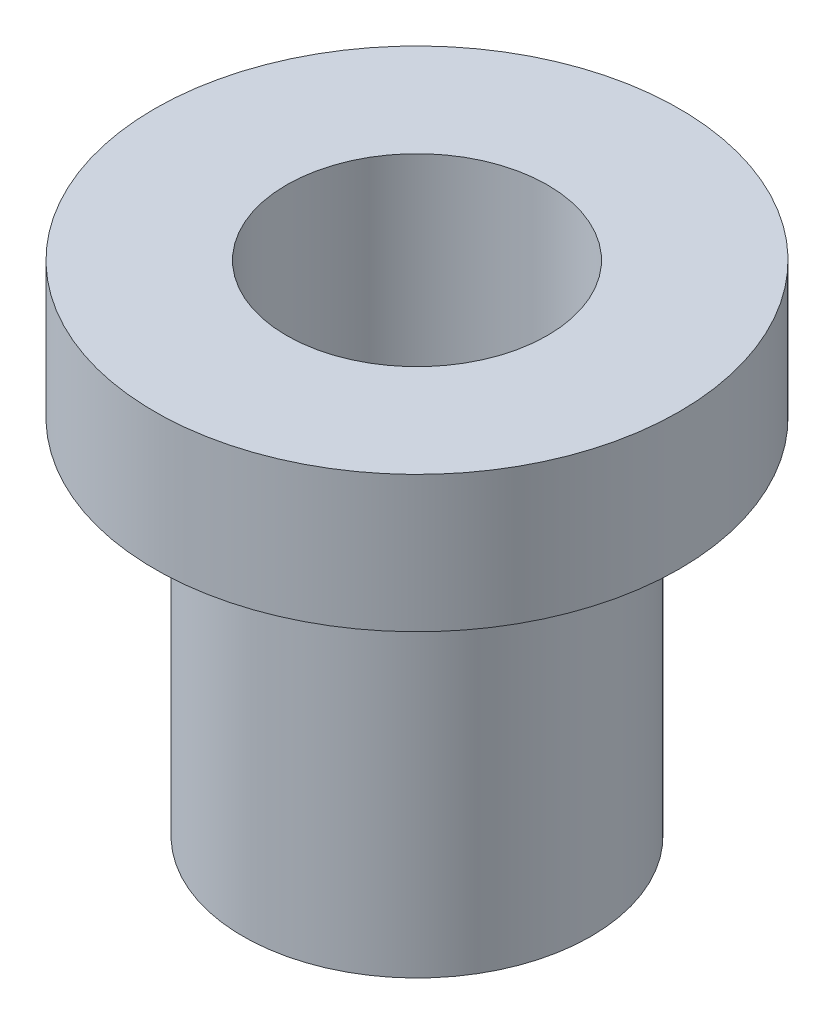
ISO-10303-21;
HEADER;
FILE_DESCRIPTION(('STEP AP214'),'2;1');
FILE_NAME('part.step','',(''),(''),'','','');
FILE_SCHEMA(('AUTOMOTIVE_DESIGN { 1 0 10303 214 1 1 1 1 }'));
ENDSEC;
DATA;
#1=APPLICATION_CONTEXT('core data for automotive mechanical design processes');
#2=APPLICATION_PROTOCOL_DEFINITION('international standard','automotive_design',2000,#1);
#3=PRODUCT_CONTEXT('',#1,'mechanical');
#4=PRODUCT('Part','Part','',(#3));
#5=PRODUCT_RELATED_PRODUCT_CATEGORY('part','',(#4));
#6=PRODUCT_DEFINITION_FORMATION('','',#4);
#7=PRODUCT_DEFINITION_CONTEXT('part definition',#1,'design');
#8=PRODUCT_DEFINITION('design','',#6,#7);
#9=PRODUCT_DEFINITION_SHAPE('','',#8);
#10=(LENGTH_UNIT() NAMED_UNIT(*) SI_UNIT(.MILLI.,.METRE.));
#11=(NAMED_UNIT(*) PLANE_ANGLE_UNIT() SI_UNIT($,.RADIAN.));
#12=(NAMED_UNIT(*) SI_UNIT($,.STERADIAN.) SOLID_ANGLE_UNIT());
#13=UNCERTAINTY_MEASURE_WITH_UNIT(LENGTH_MEASURE(1.E-05),#10,'distance_accuracy_value','');
#14=(GEOMETRIC_REPRESENTATION_CONTEXT(3) GLOBAL_UNCERTAINTY_ASSIGNED_CONTEXT((#13)) GLOBAL_UNIT_ASSIGNED_CONTEXT((#10,
#11,#12)) REPRESENTATION_CONTEXT('',''));
#15=CARTESIAN_POINT('',(0.,0.,0.));
#16=DIRECTION('',(0.,0.,1.));
#17=DIRECTION('',(1.,0.,0.));
#18=AXIS2_PLACEMENT_3D('',#15,#16,#17);
#19=CARTESIAN_POINT('',(-1.524,-1.1938,0.));
#20=DIRECTION('',(0.,-1.,0.));
#21=DIRECTION('',(1.,0.,0.));
#22=AXIS2_PLACEMENT_3D('',#19,#20,#21);
#23=PLANE('',#22);
#24=CARTESIAN_POINT('',(0.,-1.1938,0.));
#25=DIRECTION('',(0.,1.,0.));
#26=DIRECTION('',(-1.,0.,0.));
#27=AXIS2_PLACEMENT_3D('',#24,#25,#26);
#28=CIRCLE('',#27,1.524);
#29=CARTESIAN_POINT('',(-1.524,-1.1938,0.));
#30=VERTEX_POINT('',#29);
#31=EDGE_CURVE('E18',#30,#30,#28,.F.);
#32=ORIENTED_EDGE('',*,*,#31,.F.);
#33=EDGE_LOOP('',(#32));
#34=FACE_BOUND('',#33,.T.);
#35=CARTESIAN_POINT('',(0.,-1.1938,0.));
#36=DIRECTION('',(0.,1.,0.));
#37=DIRECTION('',(-1.,0.,0.));
#38=AXIS2_PLACEMENT_3D('',#35,#36,#37);
#39=CIRCLE('',#38,2.2987);
#40=CARTESIAN_POINT('',(-2.2987,-1.1938,0.));
#41=VERTEX_POINT('',#40);
#42=EDGE_CURVE('E34',#41,#41,#39,.T.);
#43=ORIENTED_EDGE('',*,*,#42,.F.);
#44=EDGE_LOOP('',(#43));
#45=FACE_BOUND('',#44,.T.);
#46=ADVANCED_FACE('F15',(#34,#45),#23,.T.);
#47=CARTESIAN_POINT('',(0.,0.,0.));
#48=DIRECTION('',(0.,1.,0.));
#49=DIRECTION('',(-1.,0.,0.));
#50=AXIS2_PLACEMENT_3D('',#47,#48,#49);
#51=CYLINDRICAL_SURFACE('',#50,1.524);
#52=CARTESIAN_POINT('',(0.,-4.36879999999999,0.));
#53=DIRECTION('',(0.,1.,0.));
#54=DIRECTION('',(-1.,0.,0.));
#55=AXIS2_PLACEMENT_3D('',#52,#53,#54);
#56=CIRCLE('',#55,1.524);
#57=CARTESIAN_POINT('',(-1.524,-4.36879999999999,0.));
#58=VERTEX_POINT('',#57);
#59=EDGE_CURVE('E32',#58,#58,#56,.F.);
#60=ORIENTED_EDGE('',*,*,#59,.F.);
#61=EDGE_LOOP('',(#60));
#62=FACE_BOUND('',#61,.T.);
#63=ORIENTED_EDGE('',*,*,#31,.T.);
#64=EDGE_LOOP('',(#63));
#65=FACE_BOUND('',#64,.T.);
#66=ADVANCED_FACE('F41',(#62,#65),#51,.T.);
#67=CARTESIAN_POINT('',(0.,0.,0.));
#68=DIRECTION('',(0.,1.,0.));
#69=DIRECTION('',(-1.,0.,0.));
#70=AXIS2_PLACEMENT_3D('',#67,#68,#69);
#71=CYLINDRICAL_SURFACE('',#70,2.2987);
#72=ORIENTED_EDGE('',*,*,#42,.T.);
#73=EDGE_LOOP('',(#72));
#74=FACE_BOUND('',#73,.T.);
#75=CARTESIAN_POINT('',(0.,0.,0.));
#76=DIRECTION('',(0.,1.,0.));
#77=DIRECTION('',(-1.,0.,0.));
#78=AXIS2_PLACEMENT_3D('',#75,#76,#77);
#79=CIRCLE('',#78,2.2987);
#80=CARTESIAN_POINT('',(-2.2987,0.,0.));
#81=VERTEX_POINT('',#80);
#82=EDGE_CURVE('E27',#81,#81,#79,.T.);
#83=ORIENTED_EDGE('',*,*,#82,.F.);
#84=EDGE_LOOP('',(#83));
#85=FACE_BOUND('',#84,.T.);
#86=ADVANCED_FACE('F49',(#74,#85),#71,.T.);
#87=CARTESIAN_POINT('',(-1.143,-4.3688,0.));
#88=DIRECTION('',(0.,-1.,0.));
#89=DIRECTION('',(1.,0.,0.));
#90=AXIS2_PLACEMENT_3D('',#87,#88,#89);
#91=PLANE('',#90);
#92=CARTESIAN_POINT('',(0.,-4.3688,0.));
#93=DIRECTION('',(0.,1.,0.));
#94=DIRECTION('',(-1.,0.,0.));
#95=AXIS2_PLACEMENT_3D('',#92,#93,#94);
#96=CIRCLE('',#95,1.143);
#97=CARTESIAN_POINT('',(-1.143,-4.3688,0.));
#98=VERTEX_POINT('',#97);
#99=EDGE_CURVE('E22',#98,#98,#96,.T.);
#100=ORIENTED_EDGE('',*,*,#99,.T.);
#101=EDGE_LOOP('',(#100));
#102=FACE_BOUND('',#101,.T.);
#103=ORIENTED_EDGE('',*,*,#59,.T.);
#104=EDGE_LOOP('',(#103));
#105=FACE_BOUND('',#104,.T.);
#106=ADVANCED_FACE('F59',(#102,#105),#91,.T.);
#107=CARTESIAN_POINT('',(-2.2987,0.,0.));
#108=DIRECTION('',(0.,1.,0.));
#109=DIRECTION('',(-1.,0.,0.));
#110=AXIS2_PLACEMENT_3D('',#107,#108,#109);
#111=PLANE('',#110);
#112=CARTESIAN_POINT('',(0.,0.,0.));
#113=DIRECTION('',(0.,1.,0.));
#114=DIRECTION('',(-1.,0.,0.));
#115=AXIS2_PLACEMENT_3D('',#112,#113,#114);
#116=CIRCLE('',#115,1.143);
#117=CARTESIAN_POINT('',(-1.143,0.,0.));
#118=VERTEX_POINT('',#117);
#119=EDGE_CURVE('E10',#118,#118,#116,.F.);
#120=ORIENTED_EDGE('',*,*,#119,.T.);
#121=EDGE_LOOP('',(#120));
#122=FACE_BOUND('',#121,.T.);
#123=ORIENTED_EDGE('',*,*,#82,.T.);
#124=EDGE_LOOP('',(#123));
#125=FACE_BOUND('',#124,.T.);
#126=ADVANCED_FACE('F53',(#122,#125),#111,.T.);
#127=CARTESIAN_POINT('',(0.,0.,0.));
#128=DIRECTION('',(0.,1.,0.));
#129=DIRECTION('',(-1.,0.,0.));
#130=AXIS2_PLACEMENT_3D('',#127,#128,#129);
#131=CYLINDRICAL_SURFACE('',#130,1.143);
#132=ORIENTED_EDGE('',*,*,#99,.F.);
#133=EDGE_LOOP('',(#132));
#134=FACE_BOUND('',#133,.T.);
#135=ORIENTED_EDGE('',*,*,#119,.F.);
#136=EDGE_LOOP('',(#135));
#137=FACE_BOUND('',#136,.T.);
#138=ADVANCED_FACE('F51',(#134,#137),#131,.F.);
#139=CLOSED_SHELL('',(#46,#66,#86,#106,#126,#138));
#140=MANIFOLD_SOLID_BREP('B1',#139);
#141=ADVANCED_BREP_SHAPE_REPRESENTATION('',(#18,#140),#14);
#142=SHAPE_DEFINITION_REPRESENTATION(#9,#141);
ENDSEC;
END-ISO-10303-21;
